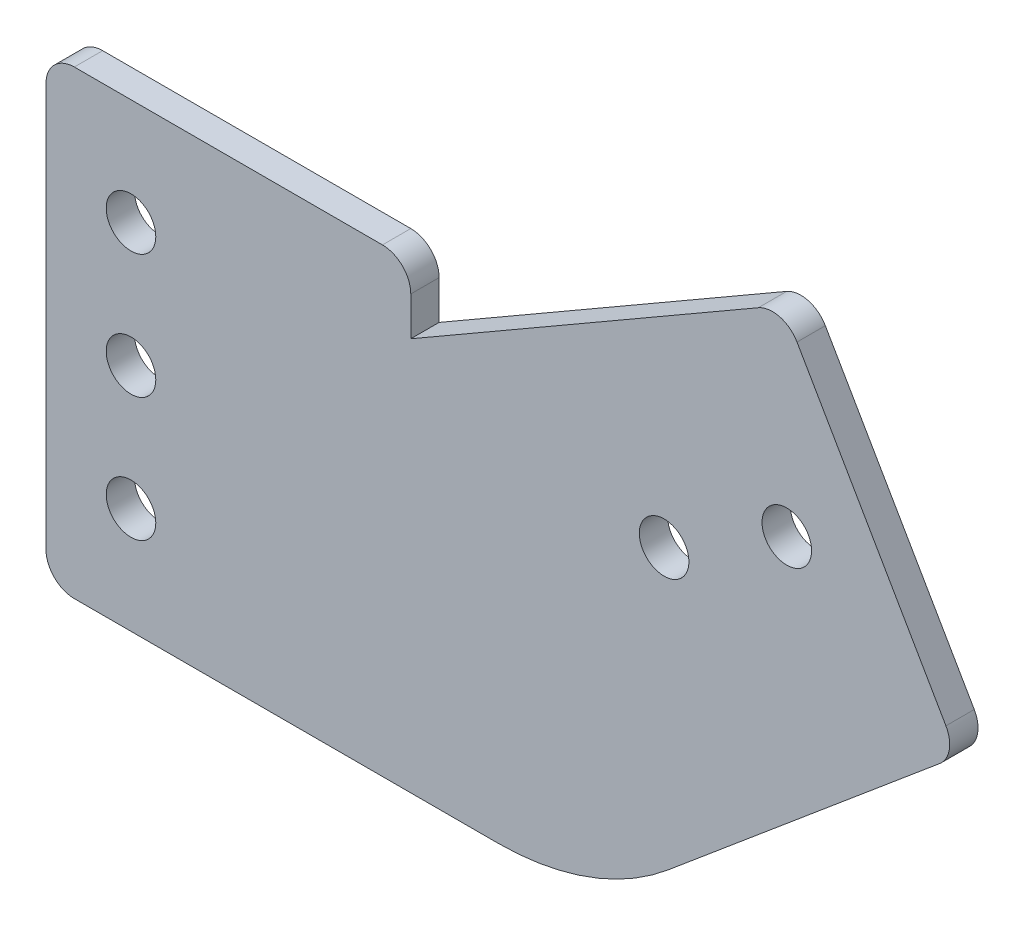
ISO-10303-21;
HEADER;
FILE_DESCRIPTION(('STEP AP214'),'2;1');
FILE_NAME('part.step','',(''),(''),'','','');
FILE_SCHEMA(('AUTOMOTIVE_DESIGN { 1 0 10303 214 1 1 1 1 }'));
ENDSEC;
DATA;
#1=APPLICATION_CONTEXT('core data for automotive mechanical design processes');
#2=APPLICATION_PROTOCOL_DEFINITION('international standard','automotive_design',2000,#1);
#3=PRODUCT_CONTEXT('',#1,'mechanical');
#4=PRODUCT('Part','Part','',(#3));
#5=PRODUCT_RELATED_PRODUCT_CATEGORY('part','',(#4));
#6=PRODUCT_DEFINITION_FORMATION('','',#4);
#7=PRODUCT_DEFINITION_CONTEXT('part definition',#1,'design');
#8=PRODUCT_DEFINITION('design','',#6,#7);
#9=PRODUCT_DEFINITION_SHAPE('','',#8);
#10=(LENGTH_UNIT() NAMED_UNIT(*) SI_UNIT(.MILLI.,.METRE.));
#11=(NAMED_UNIT(*) PLANE_ANGLE_UNIT() SI_UNIT($,.RADIAN.));
#12=(NAMED_UNIT(*) SI_UNIT($,.STERADIAN.) SOLID_ANGLE_UNIT());
#13=UNCERTAINTY_MEASURE_WITH_UNIT(LENGTH_MEASURE(1.E-05),#10,'distance_accuracy_value','');
#14=(GEOMETRIC_REPRESENTATION_CONTEXT(3) GLOBAL_UNCERTAINTY_ASSIGNED_CONTEXT((#13)) GLOBAL_UNIT_ASSIGNED_CONTEXT((#10,
#11,#12)) REPRESENTATION_CONTEXT('',''));
#15=CARTESIAN_POINT('',(0.,0.,0.));
#16=DIRECTION('',(0.,0.,1.));
#17=DIRECTION('',(1.,0.,0.));
#18=AXIS2_PLACEMENT_3D('',#15,#16,#17);
#19=CARTESIAN_POINT('',(32.3772826516069,19.2499999999996,2.));
#20=DIRECTION('',(0.,0.,1.));
#21=DIRECTION('',(1.,0.,0.));
#22=AXIS2_PLACEMENT_3D('',#19,#20,#21);
#23=PLANE('',#22);
#24=CARTESIAN_POINT('',(6.5,25.5,2.));
#25=DIRECTION('',(0.,0.,1.));
#26=DIRECTION('',(1.,0.,0.));
#27=AXIS2_PLACEMENT_3D('',#24,#25,#26);
#28=CIRCLE('',#27,1.75);
#29=CARTESIAN_POINT('',(8.25,25.5,2.));
#30=VERTEX_POINT('',#29);
#31=EDGE_CURVE('E308',#30,#30,#28,.T.);
#32=ORIENTED_EDGE('',*,*,#31,.F.);
#33=EDGE_LOOP('',(#32));
#34=FACE_BOUND('',#33,.T.);
#35=CARTESIAN_POINT('',(44.1326859021805,24.4413429510907,2.));
#36=DIRECTION('',(0.,0.,1.));
#37=DIRECTION('',(1.,0.,0.));
#38=AXIS2_PLACEMENT_3D('',#35,#36,#37);
#39=CIRCLE('',#38,1.75);
#40=CARTESIAN_POINT('',(45.8826859021805,24.4413429510907,2.));
#41=VERTEX_POINT('',#40);
#42=EDGE_CURVE('E320',#41,#41,#39,.T.);
#43=ORIENTED_EDGE('',*,*,#42,.F.);
#44=EDGE_LOOP('',(#43));
#45=FACE_BOUND('',#44,.T.);
#46=CARTESIAN_POINT('',(32.3772826516069,19.2499999999996,2.));
#47=DIRECTION('',(0.,0.,1.));
#48=DIRECTION('',(1.,0.,0.));
#49=AXIS2_PLACEMENT_3D('',#46,#47,#48);
#50=CIRCLE('',#49,18.7499999999996);
#51=CARTESIAN_POINT('',(32.3772826516069,0.5,2.));
#52=VERTEX_POINT('',#51);
#53=CARTESIAN_POINT('',(44.42955033323,4.88666669151968,2.));
#54=VERTEX_POINT('',#53);
#55=EDGE_CURVE('E185',#52,#54,#50,.T.);
#56=ORIENTED_EDGE('',*,*,#55,.T.);
#57=DIRECTION('',(0.766044443118945,0.642787609686579,0.));
#58=VECTOR('',#57,1.);
#59=CARTESIAN_POINT('',(44.42955033323,4.88666669151968,2.));
#60=LINE('',#59,#58);
#61=CARTESIAN_POINT('',(63.5785989267112,20.9546263037073,2.));
#62=VERTEX_POINT('',#61);
#63=EDGE_CURVE('E108',#54,#62,#60,.T.);
#64=ORIENTED_EDGE('',*,*,#63,.T.);
#65=CARTESIAN_POINT('',(62.293023707338,22.4867151899451,2.));
#66=DIRECTION('',(0.,0.,1.));
#67=DIRECTION('',(-1.,0.,0.));
#68=AXIS2_PLACEMENT_3D('',#65,#66,#67);
#69=CIRCLE('',#68,2.);
#70=CARTESIAN_POINT('',(64.0250745149068,23.4867151899452,2.));
#71=VERTEX_POINT('',#70);
#72=EDGE_CURVE('E215',#62,#71,#69,.T.);
#73=ORIENTED_EDGE('',*,*,#72,.T.);
#74=DIRECTION('',(-0.500000000000046,0.866025403784412,0.));
#75=VECTOR('',#74,1.);
#76=CARTESIAN_POINT('',(64.0250745149068,23.4867151899452,2.));
#77=LINE('',#76,#75);
#78=CARTESIAN_POINT('',(53.513611415569,41.6931033398816,2.));
#79=VERTEX_POINT('',#78);
#80=EDGE_CURVE('E234',#71,#79,#77,.T.);
#81=ORIENTED_EDGE('',*,*,#80,.T.);
#82=CARTESIAN_POINT('',(51.7815606080001,40.6931033398816,2.));
#83=DIRECTION('',(0.,0.,1.));
#84=DIRECTION('',(-1.,0.,0.));
#85=AXIS2_PLACEMENT_3D('',#82,#83,#84);
#86=CIRCLE('',#85,1.99999999999999);
#87=CARTESIAN_POINT('',(50.781560608,42.4251541474504,2.));
#88=VERTEX_POINT('',#87);
#89=EDGE_CURVE('E231',#79,#88,#86,.T.);
#90=ORIENTED_EDGE('',*,*,#89,.T.);
#91=DIRECTION('',(-0.866025403784413,-0.500000000000045,0.));
#92=VECTOR('',#91,1.);
#93=CARTESIAN_POINT('',(50.781560608,42.4251541474504,2.));
#94=LINE('',#93,#92);
#95=CARTESIAN_POINT('',(26.2500000000003,28.2618510267784,2.));
#96=VERTEX_POINT('',#95);
#97=EDGE_CURVE('E233',#88,#96,#94,.T.);
#98=ORIENTED_EDGE('',*,*,#97,.T.);
#99=DIRECTION('',(0.,1.,0.));
#100=VECTOR('',#99,1.);
#101=CARTESIAN_POINT('',(26.2500000000003,28.2618510267784,2.));
#102=LINE('',#101,#100);
#103=CARTESIAN_POINT('',(26.2500000000003,31.,2.));
#104=VERTEX_POINT('',#103);
#105=EDGE_CURVE('E236',#96,#104,#102,.T.);
#106=ORIENTED_EDGE('',*,*,#105,.T.);
#107=CARTESIAN_POINT('',(24.2500000000003,31.,2.));
#108=DIRECTION('',(0.,0.,1.));
#109=DIRECTION('',(-1.,0.,0.));
#110=AXIS2_PLACEMENT_3D('',#107,#108,#109);
#111=CIRCLE('',#110,2.);
#112=CARTESIAN_POINT('',(24.2500000000003,33.,2.));
#113=VERTEX_POINT('',#112);
#114=EDGE_CURVE('E242',#104,#113,#111,.T.);
#115=ORIENTED_EDGE('',*,*,#114,.T.);
#116=DIRECTION('',(-1.,0.,0.));
#117=VECTOR('',#116,1.);
#118=CARTESIAN_POINT('',(24.2500000000003,33.,2.));
#119=LINE('',#118,#117);
#120=CARTESIAN_POINT('',(2.5,33.,2.));
#121=VERTEX_POINT('',#120);
#122=EDGE_CURVE('E244',#113,#121,#119,.T.);
#123=ORIENTED_EDGE('',*,*,#122,.T.);
#124=CARTESIAN_POINT('',(2.5,31.,2.));
#125=DIRECTION('',(0.,0.,1.));
#126=DIRECTION('',(-1.,0.,0.));
#127=AXIS2_PLACEMENT_3D('',#124,#125,#126);
#128=CIRCLE('',#127,2.);
#129=CARTESIAN_POINT('',(0.5,31.,2.));
#130=VERTEX_POINT('',#129);
#131=EDGE_CURVE('E142',#121,#130,#128,.T.);
#132=ORIENTED_EDGE('',*,*,#131,.T.);
#133=DIRECTION('',(0.,-1.,0.));
#134=VECTOR('',#133,1.);
#135=CARTESIAN_POINT('',(0.5,31.,2.));
#136=LINE('',#135,#134);
#137=CARTESIAN_POINT('',(0.500000000000002,2.5,2.));
#138=VERTEX_POINT('',#137);
#139=EDGE_CURVE('E136',#130,#138,#136,.T.);
#140=ORIENTED_EDGE('',*,*,#139,.T.);
#141=CARTESIAN_POINT('',(2.5,2.5,2.));
#142=DIRECTION('',(0.,0.,1.));
#143=DIRECTION('',(-1.,0.,0.));
#144=AXIS2_PLACEMENT_3D('',#141,#142,#143);
#145=CIRCLE('',#144,2.);
#146=CARTESIAN_POINT('',(2.5,0.5,2.));
#147=VERTEX_POINT('',#146);
#148=EDGE_CURVE('E140',#138,#147,#145,.T.);
#149=ORIENTED_EDGE('',*,*,#148,.T.);
#150=DIRECTION('',(1.,0.,0.));
#151=VECTOR('',#150,1.);
#152=CARTESIAN_POINT('',(2.5,0.5,2.));
#153=LINE('',#152,#151);
#154=EDGE_CURVE('E50',#147,#52,#153,.T.);
#155=ORIENTED_EDGE('',*,*,#154,.T.);
#156=EDGE_LOOP('',(#56,#64,#73,#81,#90,#98,#106,#115,#123,#132,#140,#149,#155));
#157=FACE_BOUND('',#156,.T.);
#158=CARTESIAN_POINT('',(52.7929399400246,29.4413429510911,2.));
#159=DIRECTION('',(0.,0.,1.));
#160=DIRECTION('',(1.,0.,0.));
#161=AXIS2_PLACEMENT_3D('',#158,#159,#160);
#162=CIRCLE('',#161,1.75);
#163=CARTESIAN_POINT('',(54.5429399400246,29.4413429510911,2.));
#164=VERTEX_POINT('',#163);
#165=EDGE_CURVE('E164',#164,#164,#162,.T.);
#166=ORIENTED_EDGE('',*,*,#165,.F.);
#167=EDGE_LOOP('',(#166));
#168=FACE_BOUND('',#167,.T.);
#169=CARTESIAN_POINT('',(6.5,16.75,2.));
#170=DIRECTION('',(0.,0.,1.));
#171=DIRECTION('',(1.,0.,0.));
#172=AXIS2_PLACEMENT_3D('',#169,#170,#171);
#173=CIRCLE('',#172,1.75);
#174=CARTESIAN_POINT('',(8.25,16.75,2.));
#175=VERTEX_POINT('',#174);
#176=EDGE_CURVE('E314',#175,#175,#173,.T.);
#177=ORIENTED_EDGE('',*,*,#176,.F.);
#178=EDGE_LOOP('',(#177));
#179=FACE_BOUND('',#178,.T.);
#180=CARTESIAN_POINT('',(6.5,8.,2.));
#181=DIRECTION('',(0.,0.,1.));
#182=DIRECTION('',(1.,0.,0.));
#183=AXIS2_PLACEMENT_3D('',#180,#181,#182);
#184=CIRCLE('',#183,1.75);
#185=CARTESIAN_POINT('',(8.25,8.,2.));
#186=VERTEX_POINT('',#185);
#187=EDGE_CURVE('E299',#186,#186,#184,.T.);
#188=ORIENTED_EDGE('',*,*,#187,.F.);
#189=EDGE_LOOP('',(#188));
#190=FACE_BOUND('',#189,.T.);
#191=ADVANCED_FACE('F33',(#34,#45,#157,#168,#179,#190),#23,.T.);
#192=CARTESIAN_POINT('',(32.3772826516069,19.2499999999996,0.));
#193=DIRECTION('',(0.,0.,1.));
#194=DIRECTION('',(1.,0.,0.));
#195=AXIS2_PLACEMENT_3D('',#192,#193,#194);
#196=PLANE('',#195);
#197=CARTESIAN_POINT('',(32.3772826516069,19.2499999999996,0.));
#198=DIRECTION('',(0.,0.,1.));
#199=DIRECTION('',(1.,0.,0.));
#200=AXIS2_PLACEMENT_3D('',#197,#198,#199);
#201=CIRCLE('',#200,18.7499999999996);
#202=CARTESIAN_POINT('',(32.3772826516069,0.5,0.));
#203=VERTEX_POINT('',#202);
#204=CARTESIAN_POINT('',(44.42955033323,4.88666669151968,0.));
#205=VERTEX_POINT('',#204);
#206=EDGE_CURVE('E160',#203,#205,#201,.T.);
#207=ORIENTED_EDGE('',*,*,#206,.F.);
#208=DIRECTION('',(1.,0.,0.));
#209=VECTOR('',#208,1.);
#210=CARTESIAN_POINT('',(2.5,0.5,0.));
#211=LINE('',#210,#209);
#212=CARTESIAN_POINT('',(2.5,0.5,0.));
#213=VERTEX_POINT('',#212);
#214=EDGE_CURVE('E100',#213,#203,#211,.T.);
#215=ORIENTED_EDGE('',*,*,#214,.F.);
#216=CARTESIAN_POINT('',(2.5,2.5,0.));
#217=DIRECTION('',(0.,0.,1.));
#218=DIRECTION('',(-1.,0.,0.));
#219=AXIS2_PLACEMENT_3D('',#216,#217,#218);
#220=CIRCLE('',#219,2.);
#221=CARTESIAN_POINT('',(0.500000000000002,2.5,0.));
#222=VERTEX_POINT('',#221);
#223=EDGE_CURVE('E94',#222,#213,#220,.T.);
#224=ORIENTED_EDGE('',*,*,#223,.F.);
#225=DIRECTION('',(0.,-1.,0.));
#226=VECTOR('',#225,1.);
#227=CARTESIAN_POINT('',(0.5,31.,0.));
#228=LINE('',#227,#226);
#229=CARTESIAN_POINT('',(0.5,31.,0.));
#230=VERTEX_POINT('',#229);
#231=EDGE_CURVE('E150',#230,#222,#228,.T.);
#232=ORIENTED_EDGE('',*,*,#231,.F.);
#233=CARTESIAN_POINT('',(2.5,31.,0.));
#234=DIRECTION('',(0.,0.,1.));
#235=DIRECTION('',(-1.,0.,0.));
#236=AXIS2_PLACEMENT_3D('',#233,#234,#235);
#237=CIRCLE('',#236,2.);
#238=CARTESIAN_POINT('',(2.5,33.,0.));
#239=VERTEX_POINT('',#238);
#240=EDGE_CURVE('E180',#239,#230,#237,.T.);
#241=ORIENTED_EDGE('',*,*,#240,.F.);
#242=DIRECTION('',(-1.,0.,0.));
#243=VECTOR('',#242,1.);
#244=CARTESIAN_POINT('',(24.2500000000003,33.,0.));
#245=LINE('',#244,#243);
#246=CARTESIAN_POINT('',(24.2500000000003,33.,0.));
#247=VERTEX_POINT('',#246);
#248=EDGE_CURVE('E178',#247,#239,#245,.T.);
#249=ORIENTED_EDGE('',*,*,#248,.F.);
#250=CARTESIAN_POINT('',(24.2500000000003,31.,0.));
#251=DIRECTION('',(0.,0.,1.));
#252=DIRECTION('',(-1.,0.,0.));
#253=AXIS2_PLACEMENT_3D('',#250,#251,#252);
#254=CIRCLE('',#253,2.);
#255=CARTESIAN_POINT('',(26.2500000000003,31.,0.));
#256=VERTEX_POINT('',#255);
#257=EDGE_CURVE('E176',#256,#247,#254,.T.);
#258=ORIENTED_EDGE('',*,*,#257,.F.);
#259=DIRECTION('',(0.,1.,0.));
#260=VECTOR('',#259,1.);
#261=CARTESIAN_POINT('',(26.2500000000003,28.2618510267784,0.));
#262=LINE('',#261,#260);
#263=CARTESIAN_POINT('',(26.2500000000003,28.2618510267784,0.));
#264=VERTEX_POINT('',#263);
#265=EDGE_CURVE('E174',#264,#256,#262,.T.);
#266=ORIENTED_EDGE('',*,*,#265,.F.);
#267=DIRECTION('',(-0.866025403784413,-0.500000000000045,0.));
#268=VECTOR('',#267,1.);
#269=CARTESIAN_POINT('',(50.781560608,42.4251541474504,0.));
#270=LINE('',#269,#268);
#271=CARTESIAN_POINT('',(50.781560608,42.4251541474504,0.));
#272=VERTEX_POINT('',#271);
#273=EDGE_CURVE('E172',#272,#264,#270,.T.);
#274=ORIENTED_EDGE('',*,*,#273,.F.);
#275=CARTESIAN_POINT('',(51.7815606080001,40.6931033398816,0.));
#276=DIRECTION('',(0.,0.,1.));
#277=DIRECTION('',(-1.,0.,0.));
#278=AXIS2_PLACEMENT_3D('',#275,#276,#277);
#279=CIRCLE('',#278,1.99999999999999);
#280=CARTESIAN_POINT('',(53.513611415569,41.6931033398816,0.));
#281=VERTEX_POINT('',#280);
#282=EDGE_CURVE('E170',#281,#272,#279,.T.);
#283=ORIENTED_EDGE('',*,*,#282,.F.);
#284=DIRECTION('',(-0.500000000000046,0.866025403784412,0.));
#285=VECTOR('',#284,1.);
#286=CARTESIAN_POINT('',(64.0250745149068,23.4867151899452,0.));
#287=LINE('',#286,#285);
#288=CARTESIAN_POINT('',(64.0250745149068,23.4867151899452,0.));
#289=VERTEX_POINT('',#288);
#290=EDGE_CURVE('E168',#289,#281,#287,.T.);
#291=ORIENTED_EDGE('',*,*,#290,.F.);
#292=CARTESIAN_POINT('',(62.293023707338,22.4867151899451,0.));
#293=DIRECTION('',(0.,0.,1.));
#294=DIRECTION('',(-1.,0.,0.));
#295=AXIS2_PLACEMENT_3D('',#292,#293,#294);
#296=CIRCLE('',#295,2.);
#297=CARTESIAN_POINT('',(63.5785989267112,20.9546263037073,0.));
#298=VERTEX_POINT('',#297);
#299=EDGE_CURVE('E166',#298,#289,#296,.T.);
#300=ORIENTED_EDGE('',*,*,#299,.F.);
#301=DIRECTION('',(0.766044443118945,0.642787609686579,0.));
#302=VECTOR('',#301,1.);
#303=CARTESIAN_POINT('',(44.42955033323,4.88666669151968,0.));
#304=LINE('',#303,#302);
#305=EDGE_CURVE('E163',#205,#298,#304,.T.);
#306=ORIENTED_EDGE('',*,*,#305,.F.);
#307=EDGE_LOOP('',(#207,#215,#224,#232,#241,#249,#258,#266,#274,#283,#291,#300,#306));
#308=FACE_BOUND('',#307,.T.);
#309=CARTESIAN_POINT('',(52.7929399400246,29.4413429510911,0.));
#310=DIRECTION('',(0.,0.,1.));
#311=DIRECTION('',(1.,0.,0.));
#312=AXIS2_PLACEMENT_3D('',#309,#310,#311);
#313=CIRCLE('',#312,1.75);
#314=CARTESIAN_POINT('',(54.5429399400246,29.4413429510911,0.));
#315=VERTEX_POINT('',#314);
#316=EDGE_CURVE('E323',#315,#315,#313,.T.);
#317=ORIENTED_EDGE('',*,*,#316,.T.);
#318=EDGE_LOOP('',(#317));
#319=FACE_BOUND('',#318,.T.);
#320=CARTESIAN_POINT('',(44.1326859021805,24.4413429510907,0.));
#321=DIRECTION('',(0.,0.,1.));
#322=DIRECTION('',(1.,0.,0.));
#323=AXIS2_PLACEMENT_3D('',#320,#321,#322);
#324=CIRCLE('',#323,1.75);
#325=CARTESIAN_POINT('',(45.8826859021805,24.4413429510907,0.));
#326=VERTEX_POINT('',#325);
#327=EDGE_CURVE('E317',#326,#326,#324,.T.);
#328=ORIENTED_EDGE('',*,*,#327,.T.);
#329=EDGE_LOOP('',(#328));
#330=FACE_BOUND('',#329,.T.);
#331=CARTESIAN_POINT('',(6.5,16.75,0.));
#332=DIRECTION('',(0.,0.,1.));
#333=DIRECTION('',(1.,0.,0.));
#334=AXIS2_PLACEMENT_3D('',#331,#332,#333);
#335=CIRCLE('',#334,1.75);
#336=CARTESIAN_POINT('',(8.25,16.75,0.));
#337=VERTEX_POINT('',#336);
#338=EDGE_CURVE('E311',#337,#337,#335,.T.);
#339=ORIENTED_EDGE('',*,*,#338,.T.);
#340=EDGE_LOOP('',(#339));
#341=FACE_BOUND('',#340,.T.);
#342=CARTESIAN_POINT('',(6.5,25.5,0.));
#343=DIRECTION('',(0.,0.,1.));
#344=DIRECTION('',(1.,0.,0.));
#345=AXIS2_PLACEMENT_3D('',#342,#343,#344);
#346=CIRCLE('',#345,1.75);
#347=CARTESIAN_POINT('',(8.25,25.5,0.));
#348=VERTEX_POINT('',#347);
#349=EDGE_CURVE('E305',#348,#348,#346,.T.);
#350=ORIENTED_EDGE('',*,*,#349,.T.);
#351=EDGE_LOOP('',(#350));
#352=FACE_BOUND('',#351,.T.);
#353=CARTESIAN_POINT('',(6.5,8.,0.));
#354=DIRECTION('',(0.,0.,1.));
#355=DIRECTION('',(1.,0.,0.));
#356=AXIS2_PLACEMENT_3D('',#353,#354,#355);
#357=CIRCLE('',#356,1.75);
#358=CARTESIAN_POINT('',(8.25,8.,0.));
#359=VERTEX_POINT('',#358);
#360=EDGE_CURVE('E302',#359,#359,#357,.T.);
#361=ORIENTED_EDGE('',*,*,#360,.T.);
#362=EDGE_LOOP('',(#361));
#363=FACE_BOUND('',#362,.T.);
#364=ADVANCED_FACE('F219',(#308,#319,#330,#341,#352,#363),#196,.F.);
#365=CARTESIAN_POINT('',(32.3772826516069,19.2499999999996,2.));
#366=DIRECTION('',(0.,0.,-1.));
#367=DIRECTION('',(-1.,0.,0.));
#368=AXIS2_PLACEMENT_3D('',#365,#366,#367);
#369=CYLINDRICAL_SURFACE('',#368,18.7499999999996);
#370=ORIENTED_EDGE('',*,*,#206,.T.);
#371=DIRECTION('',(0.,0.,-1.));
#372=VECTOR('',#371,1.);
#373=CARTESIAN_POINT('',(44.42955033323,4.88666669151968,2.));
#374=LINE('',#373,#372);
#375=EDGE_CURVE('E11',#54,#205,#374,.T.);
#376=ORIENTED_EDGE('',*,*,#375,.F.);
#377=ORIENTED_EDGE('',*,*,#55,.F.);
#378=DIRECTION('',(0.,0.,-1.));
#379=VECTOR('',#378,1.);
#380=CARTESIAN_POINT('',(32.3772826516069,0.5,2.));
#381=LINE('',#380,#379);
#382=EDGE_CURVE('E156',#52,#203,#381,.T.);
#383=ORIENTED_EDGE('',*,*,#382,.T.);
#384=EDGE_LOOP('',(#370,#376,#377,#383));
#385=FACE_BOUND('',#384,.T.);
#386=ADVANCED_FACE('F35',(#385),#369,.T.);
#387=CARTESIAN_POINT('',(44.42955033323,4.88666669151968,2.));
#388=DIRECTION('',(-0.642787609686579,0.766044443118945,0.));
#389=DIRECTION('',(-0.766044443118945,-0.642787609686579,0.));
#390=AXIS2_PLACEMENT_3D('',#387,#388,#389);
#391=PLANE('',#390);
#392=ORIENTED_EDGE('',*,*,#305,.T.);
#393=DIRECTION('',(0.,0.,-1.));
#394=VECTOR('',#393,1.);
#395=CARTESIAN_POINT('',(63.5785989267112,20.9546263037073,2.));
#396=LINE('',#395,#394);
#397=EDGE_CURVE('E42',#62,#298,#396,.T.);
#398=ORIENTED_EDGE('',*,*,#397,.F.);
#399=ORIENTED_EDGE('',*,*,#63,.F.);
#400=ORIENTED_EDGE('',*,*,#375,.T.);
#401=EDGE_LOOP('',(#392,#398,#399,#400));
#402=FACE_BOUND('',#401,.T.);
#403=ADVANCED_FACE('F452',(#402),#391,.F.);
#404=CARTESIAN_POINT('',(62.293023707338,22.4867151899451,2.));
#405=DIRECTION('',(0.,0.,-1.));
#406=DIRECTION('',(-1.,0.,0.));
#407=AXIS2_PLACEMENT_3D('',#404,#405,#406);
#408=CYLINDRICAL_SURFACE('',#407,2.);
#409=ORIENTED_EDGE('',*,*,#299,.T.);
#410=DIRECTION('',(0.,0.,-1.));
#411=VECTOR('',#410,1.);
#412=CARTESIAN_POINT('',(64.0250745149068,23.4867151899452,2.));
#413=LINE('',#412,#411);
#414=EDGE_CURVE('E207',#71,#289,#413,.T.);
#415=ORIENTED_EDGE('',*,*,#414,.F.);
#416=ORIENTED_EDGE('',*,*,#72,.F.);
#417=ORIENTED_EDGE('',*,*,#397,.T.);
#418=EDGE_LOOP('',(#409,#415,#416,#417));
#419=FACE_BOUND('',#418,.T.);
#420=ADVANCED_FACE('F213',(#419),#408,.T.);
#421=CARTESIAN_POINT('',(64.0250745149068,23.4867151899452,2.));
#422=DIRECTION('',(-0.866025403784412,-0.500000000000046,0.));
#423=DIRECTION('',(0.500000000000046,-0.866025403784412,0.));
#424=AXIS2_PLACEMENT_3D('',#421,#422,#423);
#425=PLANE('',#424);
#426=ORIENTED_EDGE('',*,*,#290,.T.);
#427=DIRECTION('',(0.,0.,-1.));
#428=VECTOR('',#427,1.);
#429=CARTESIAN_POINT('',(53.513611415569,41.6931033398816,2.));
#430=LINE('',#429,#428);
#431=EDGE_CURVE('E204',#79,#281,#430,.T.);
#432=ORIENTED_EDGE('',*,*,#431,.F.);
#433=ORIENTED_EDGE('',*,*,#80,.F.);
#434=ORIENTED_EDGE('',*,*,#414,.T.);
#435=EDGE_LOOP('',(#426,#432,#433,#434));
#436=FACE_BOUND('',#435,.T.);
#437=ADVANCED_FACE('F225',(#436),#425,.F.);
#438=CARTESIAN_POINT('',(51.7815606080001,40.6931033398816,2.));
#439=DIRECTION('',(0.,0.,-1.));
#440=DIRECTION('',(-1.,0.,0.));
#441=AXIS2_PLACEMENT_3D('',#438,#439,#440);
#442=CYLINDRICAL_SURFACE('',#441,1.99999999999999);
#443=ORIENTED_EDGE('',*,*,#282,.T.);
#444=DIRECTION('',(0.,0.,-1.));
#445=VECTOR('',#444,1.);
#446=CARTESIAN_POINT('',(50.781560608,42.4251541474504,2.));
#447=LINE('',#446,#445);
#448=EDGE_CURVE('E201',#88,#272,#447,.T.);
#449=ORIENTED_EDGE('',*,*,#448,.F.);
#450=ORIENTED_EDGE('',*,*,#89,.F.);
#451=ORIENTED_EDGE('',*,*,#431,.T.);
#452=EDGE_LOOP('',(#443,#449,#450,#451));
#453=FACE_BOUND('',#452,.T.);
#454=ADVANCED_FACE('F229',(#453),#442,.T.);
#455=CARTESIAN_POINT('',(50.781560608,42.4251541474504,2.));
#456=DIRECTION('',(0.500000000000045,-0.866025403784413,0.));
#457=DIRECTION('',(0.866025403784413,0.500000000000045,0.));
#458=AXIS2_PLACEMENT_3D('',#455,#456,#457);
#459=PLANE('',#458);
#460=ORIENTED_EDGE('',*,*,#273,.T.);
#461=DIRECTION('',(0.,0.,-1.));
#462=VECTOR('',#461,1.);
#463=CARTESIAN_POINT('',(26.2500000000003,28.2618510267784,2.));
#464=LINE('',#463,#462);
#465=EDGE_CURVE('E198',#96,#264,#464,.T.);
#466=ORIENTED_EDGE('',*,*,#465,.F.);
#467=ORIENTED_EDGE('',*,*,#97,.F.);
#468=ORIENTED_EDGE('',*,*,#448,.T.);
#469=EDGE_LOOP('',(#460,#466,#467,#468));
#470=FACE_BOUND('',#469,.T.);
#471=ADVANCED_FACE('F417',(#470),#459,.F.);
#472=CARTESIAN_POINT('',(26.2500000000003,28.2618510267784,2.));
#473=DIRECTION('',(-1.,0.,0.));
#474=DIRECTION('',(0.,0.,1.));
#475=AXIS2_PLACEMENT_3D('',#472,#473,#474);
#476=PLANE('',#475);
#477=ORIENTED_EDGE('',*,*,#265,.T.);
#478=DIRECTION('',(0.,0.,-1.));
#479=VECTOR('',#478,1.);
#480=CARTESIAN_POINT('',(26.2500000000003,31.,2.));
#481=LINE('',#480,#479);
#482=EDGE_CURVE('E195',#104,#256,#481,.T.);
#483=ORIENTED_EDGE('',*,*,#482,.F.);
#484=ORIENTED_EDGE('',*,*,#105,.F.);
#485=ORIENTED_EDGE('',*,*,#465,.T.);
#486=EDGE_LOOP('',(#477,#483,#484,#485));
#487=FACE_BOUND('',#486,.T.);
#488=ADVANCED_FACE('F407',(#487),#476,.F.);
#489=CARTESIAN_POINT('',(24.2500000000003,31.,2.));
#490=DIRECTION('',(0.,0.,-1.));
#491=DIRECTION('',(-1.,0.,0.));
#492=AXIS2_PLACEMENT_3D('',#489,#490,#491);
#493=CYLINDRICAL_SURFACE('',#492,2.);
#494=ORIENTED_EDGE('',*,*,#257,.T.);
#495=DIRECTION('',(0.,0.,-1.));
#496=VECTOR('',#495,1.);
#497=CARTESIAN_POINT('',(24.2500000000003,33.,2.));
#498=LINE('',#497,#496);
#499=EDGE_CURVE('E192',#113,#247,#498,.T.);
#500=ORIENTED_EDGE('',*,*,#499,.F.);
#501=ORIENTED_EDGE('',*,*,#114,.F.);
#502=ORIENTED_EDGE('',*,*,#482,.T.);
#503=EDGE_LOOP('',(#494,#500,#501,#502));
#504=FACE_BOUND('',#503,.T.);
#505=ADVANCED_FACE('F398',(#504),#493,.T.);
#506=CARTESIAN_POINT('',(24.2500000000003,33.,2.));
#507=DIRECTION('',(0.,-1.,0.));
#508=DIRECTION('',(0.,0.,-1.));
#509=AXIS2_PLACEMENT_3D('',#506,#507,#508);
#510=PLANE('',#509);
#511=ORIENTED_EDGE('',*,*,#248,.T.);
#512=DIRECTION('',(0.,0.,-1.));
#513=VECTOR('',#512,1.);
#514=CARTESIAN_POINT('',(2.5,33.,2.));
#515=LINE('',#514,#513);
#516=EDGE_CURVE('E189',#121,#239,#515,.T.);
#517=ORIENTED_EDGE('',*,*,#516,.F.);
#518=ORIENTED_EDGE('',*,*,#122,.F.);
#519=ORIENTED_EDGE('',*,*,#499,.T.);
#520=EDGE_LOOP('',(#511,#517,#518,#519));
#521=FACE_BOUND('',#520,.T.);
#522=ADVANCED_FACE('F250',(#521),#510,.F.);
#523=CARTESIAN_POINT('',(2.5,31.,2.));
#524=DIRECTION('',(0.,0.,-1.));
#525=DIRECTION('',(-1.,0.,0.));
#526=AXIS2_PLACEMENT_3D('',#523,#524,#525);
#527=CYLINDRICAL_SURFACE('',#526,2.);
#528=ORIENTED_EDGE('',*,*,#240,.T.);
#529=DIRECTION('',(0.,0.,-1.));
#530=VECTOR('',#529,1.);
#531=CARTESIAN_POINT('',(0.5,31.,2.));
#532=LINE('',#531,#530);
#533=EDGE_CURVE('E151',#130,#230,#532,.T.);
#534=ORIENTED_EDGE('',*,*,#533,.F.);
#535=ORIENTED_EDGE('',*,*,#131,.F.);
#536=ORIENTED_EDGE('',*,*,#516,.T.);
#537=EDGE_LOOP('',(#528,#534,#535,#536));
#538=FACE_BOUND('',#537,.T.);
#539=ADVANCED_FACE('F254',(#538),#527,.T.);
#540=CARTESIAN_POINT('',(0.5,31.,2.));
#541=DIRECTION('',(1.,0.,0.));
#542=DIRECTION('',(0.,1.,0.));
#543=AXIS2_PLACEMENT_3D('',#540,#541,#542);
#544=PLANE('',#543);
#545=ORIENTED_EDGE('',*,*,#231,.T.);
#546=DIRECTION('',(0.,0.,-1.));
#547=VECTOR('',#546,1.);
#548=CARTESIAN_POINT('',(0.500000000000002,2.5,2.));
#549=LINE('',#548,#547);
#550=EDGE_CURVE('E147',#138,#222,#549,.T.);
#551=ORIENTED_EDGE('',*,*,#550,.F.);
#552=ORIENTED_EDGE('',*,*,#139,.F.);
#553=ORIENTED_EDGE('',*,*,#533,.T.);
#554=EDGE_LOOP('',(#545,#551,#552,#553));
#555=FACE_BOUND('',#554,.T.);
#556=ADVANCED_FACE('F148',(#555),#544,.F.);
#557=CARTESIAN_POINT('',(2.5,2.5,2.));
#558=DIRECTION('',(0.,0.,-1.));
#559=DIRECTION('',(-1.,0.,0.));
#560=AXIS2_PLACEMENT_3D('',#557,#558,#559);
#561=CYLINDRICAL_SURFACE('',#560,2.);
#562=ORIENTED_EDGE('',*,*,#223,.T.);
#563=DIRECTION('',(0.,0.,-1.));
#564=VECTOR('',#563,1.);
#565=CARTESIAN_POINT('',(2.5,0.5,2.));
#566=LINE('',#565,#564);
#567=EDGE_CURVE('E152',#147,#213,#566,.T.);
#568=ORIENTED_EDGE('',*,*,#567,.F.);
#569=ORIENTED_EDGE('',*,*,#148,.F.);
#570=ORIENTED_EDGE('',*,*,#550,.T.);
#571=EDGE_LOOP('',(#562,#568,#569,#570));
#572=FACE_BOUND('',#571,.T.);
#573=ADVANCED_FACE('F154',(#572),#561,.T.);
#574=CARTESIAN_POINT('',(2.5,0.5,2.));
#575=DIRECTION('',(0.,1.,0.));
#576=DIRECTION('',(0.,0.,1.));
#577=AXIS2_PLACEMENT_3D('',#574,#575,#576);
#578=PLANE('',#577);
#579=ORIENTED_EDGE('',*,*,#214,.T.);
#580=ORIENTED_EDGE('',*,*,#382,.F.);
#581=ORIENTED_EDGE('',*,*,#154,.F.);
#582=ORIENTED_EDGE('',*,*,#567,.T.);
#583=EDGE_LOOP('',(#579,#580,#581,#582));
#584=FACE_BOUND('',#583,.T.);
#585=ADVANCED_FACE('F258',(#584),#578,.F.);
#586=CARTESIAN_POINT('',(52.7929399400246,29.4413429510911,2.));
#587=DIRECTION('',(0.,0.,-1.));
#588=DIRECTION('',(-1.,0.,0.));
#589=AXIS2_PLACEMENT_3D('',#586,#587,#588);
#590=CYLINDRICAL_SURFACE('',#589,1.75);
#591=ORIENTED_EDGE('',*,*,#165,.T.);
#592=EDGE_LOOP('',(#591));
#593=FACE_BOUND('',#592,.T.);
#594=ORIENTED_EDGE('',*,*,#316,.F.);
#595=EDGE_LOOP('',(#594));
#596=FACE_BOUND('',#595,.T.);
#597=ADVANCED_FACE('F260',(#593,#596),#590,.F.);
#598=CARTESIAN_POINT('',(44.1326859021805,24.4413429510907,2.));
#599=DIRECTION('',(0.,0.,-1.));
#600=DIRECTION('',(-1.,0.,0.));
#601=AXIS2_PLACEMENT_3D('',#598,#599,#600);
#602=CYLINDRICAL_SURFACE('',#601,1.75);
#603=ORIENTED_EDGE('',*,*,#42,.T.);
#604=EDGE_LOOP('',(#603));
#605=FACE_BOUND('',#604,.T.);
#606=ORIENTED_EDGE('',*,*,#327,.F.);
#607=EDGE_LOOP('',(#606));
#608=FACE_BOUND('',#607,.T.);
#609=ADVANCED_FACE('F266',(#605,#608),#602,.F.);
#610=CARTESIAN_POINT('',(6.5,16.75,2.));
#611=DIRECTION('',(0.,0.,-1.));
#612=DIRECTION('',(-1.,0.,0.));
#613=AXIS2_PLACEMENT_3D('',#610,#611,#612);
#614=CYLINDRICAL_SURFACE('',#613,1.75);
#615=ORIENTED_EDGE('',*,*,#176,.T.);
#616=EDGE_LOOP('',(#615));
#617=FACE_BOUND('',#616,.T.);
#618=ORIENTED_EDGE('',*,*,#338,.F.);
#619=EDGE_LOOP('',(#618));
#620=FACE_BOUND('',#619,.T.);
#621=ADVANCED_FACE('F282',(#617,#620),#614,.F.);
#622=CARTESIAN_POINT('',(6.5,25.5,2.));
#623=DIRECTION('',(0.,0.,-1.));
#624=DIRECTION('',(-1.,0.,0.));
#625=AXIS2_PLACEMENT_3D('',#622,#623,#624);
#626=CYLINDRICAL_SURFACE('',#625,1.75);
#627=ORIENTED_EDGE('',*,*,#31,.T.);
#628=EDGE_LOOP('',(#627));
#629=FACE_BOUND('',#628,.T.);
#630=ORIENTED_EDGE('',*,*,#349,.F.);
#631=EDGE_LOOP('',(#630));
#632=FACE_BOUND('',#631,.T.);
#633=ADVANCED_FACE('F286',(#629,#632),#626,.F.);
#634=CARTESIAN_POINT('',(6.5,8.,2.));
#635=DIRECTION('',(0.,0.,-1.));
#636=DIRECTION('',(-1.,0.,0.));
#637=AXIS2_PLACEMENT_3D('',#634,#635,#636);
#638=CYLINDRICAL_SURFACE('',#637,1.75);
#639=ORIENTED_EDGE('',*,*,#187,.T.);
#640=EDGE_LOOP('',(#639));
#641=FACE_BOUND('',#640,.T.);
#642=ORIENTED_EDGE('',*,*,#360,.F.);
#643=EDGE_LOOP('',(#642));
#644=FACE_BOUND('',#643,.T.);
#645=ADVANCED_FACE('F290',(#641,#644),#638,.F.);
#646=CLOSED_SHELL('',(#191,#364,#386,#403,#420,#437,#454,#471,#488,#505,#522,#539,#556,#573,
#585,#597,#609,#621,#633,#645));
#647=MANIFOLD_SOLID_BREP('B2',#646);
#648=ADVANCED_BREP_SHAPE_REPRESENTATION('',(#18,#647),#14);
#649=SHAPE_DEFINITION_REPRESENTATION(#9,#648);
ENDSEC;
END-ISO-10303-21;
